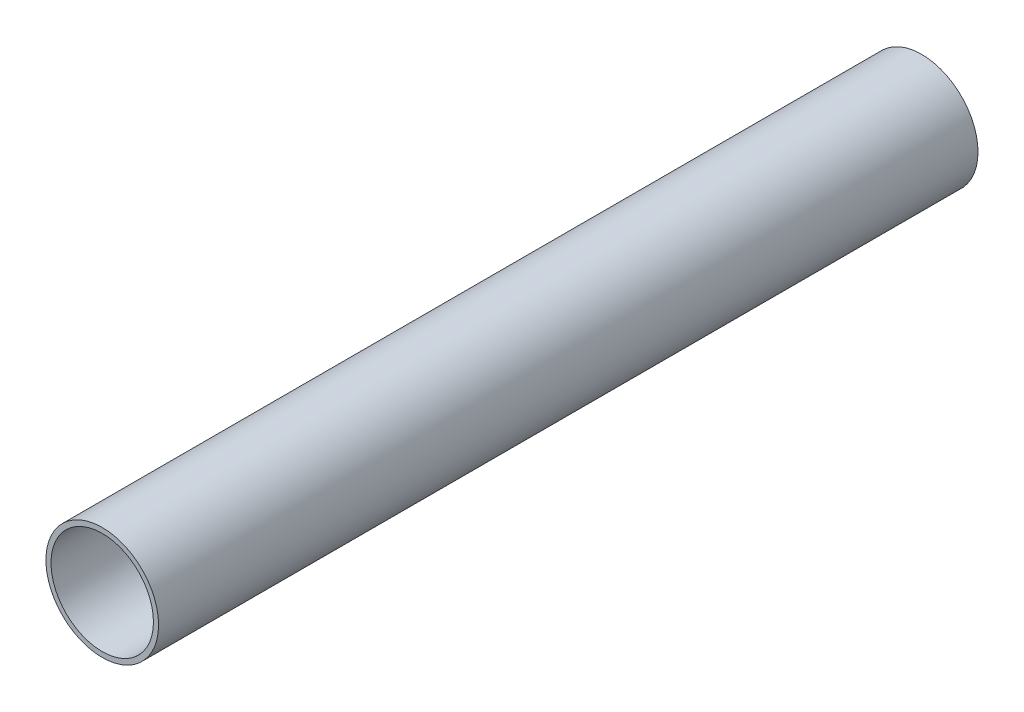
ISO-10303-21;
HEADER;
FILE_DESCRIPTION(('STEP AP214'),'2;1');
FILE_NAME('part.step','',(''),(''),'','','');
FILE_SCHEMA(('AUTOMOTIVE_DESIGN { 1 0 10303 214 1 1 1 1 }'));
ENDSEC;
DATA;
#1=APPLICATION_CONTEXT('core data for automotive mechanical design processes');
#2=APPLICATION_PROTOCOL_DEFINITION('international standard','automotive_design',2000,#1);
#3=PRODUCT_CONTEXT('',#1,'mechanical');
#4=PRODUCT('Part','Part','',(#3));
#5=PRODUCT_RELATED_PRODUCT_CATEGORY('part','',(#4));
#6=PRODUCT_DEFINITION_FORMATION('','',#4);
#7=PRODUCT_DEFINITION_CONTEXT('part definition',#1,'design');
#8=PRODUCT_DEFINITION('design','',#6,#7);
#9=PRODUCT_DEFINITION_SHAPE('','',#8);
#10=(LENGTH_UNIT() NAMED_UNIT(*) SI_UNIT(.MILLI.,.METRE.));
#11=(NAMED_UNIT(*) PLANE_ANGLE_UNIT() SI_UNIT($,.RADIAN.));
#12=(NAMED_UNIT(*) SI_UNIT($,.STERADIAN.) SOLID_ANGLE_UNIT());
#13=UNCERTAINTY_MEASURE_WITH_UNIT(LENGTH_MEASURE(1.E-05),#10,'distance_accuracy_value','');
#14=(GEOMETRIC_REPRESENTATION_CONTEXT(3) GLOBAL_UNCERTAINTY_ASSIGNED_CONTEXT((#13)) GLOBAL_UNIT_ASSIGNED_CONTEXT((#10,
#11,#12)) REPRESENTATION_CONTEXT('',''));
#15=CARTESIAN_POINT('',(0.,0.,0.));
#16=DIRECTION('',(0.,0.,1.));
#17=DIRECTION('',(1.,0.,0.));
#18=AXIS2_PLACEMENT_3D('',#15,#16,#17);
#19=CARTESIAN_POINT('',(0.,0.,80.));
#20=DIRECTION('',(0.,0.,1.));
#21=DIRECTION('',(1.,0.,0.));
#22=AXIS2_PLACEMENT_3D('',#19,#20,#21);
#23=PLANE('',#22);
#24=CARTESIAN_POINT('',(0.,0.,80.));
#25=DIRECTION('',(0.,0.,1.));
#26=DIRECTION('',(1.,0.,0.));
#27=AXIS2_PLACEMENT_3D('',#24,#25,#26);
#28=CIRCLE('',#27,5.5);
#29=CARTESIAN_POINT('',(5.5,0.,80.));
#30=VERTEX_POINT('',#29);
#31=EDGE_CURVE('E10',#30,#30,#28,.T.);
#32=ORIENTED_EDGE('',*,*,#31,.T.);
#33=EDGE_LOOP('',(#32));
#34=FACE_BOUND('',#33,.T.);
#35=CARTESIAN_POINT('',(0.,0.,80.));
#36=DIRECTION('',(0.,0.,1.));
#37=DIRECTION('',(1.,0.,0.));
#38=AXIS2_PLACEMENT_3D('',#35,#36,#37);
#39=CIRCLE('',#38,5.);
#40=CARTESIAN_POINT('',(5.,0.,80.));
#41=VERTEX_POINT('',#40);
#42=EDGE_CURVE('E50',#41,#41,#39,.T.);
#43=ORIENTED_EDGE('',*,*,#42,.F.);
#44=EDGE_LOOP('',(#43));
#45=FACE_BOUND('',#44,.T.);
#46=ADVANCED_FACE('F37',(#34,#45),#23,.T.);
#47=CARTESIAN_POINT('',(0.,0.,0.));
#48=DIRECTION('',(0.,0.,1.));
#49=DIRECTION('',(1.,0.,0.));
#50=AXIS2_PLACEMENT_3D('',#47,#48,#49);
#51=PLANE('',#50);
#52=CARTESIAN_POINT('',(0.,0.,0.));
#53=DIRECTION('',(0.,0.,1.));
#54=DIRECTION('',(1.,0.,0.));
#55=AXIS2_PLACEMENT_3D('',#52,#53,#54);
#56=CIRCLE('',#55,5.5);
#57=CARTESIAN_POINT('',(5.5,0.,0.));
#58=VERTEX_POINT('',#57);
#59=EDGE_CURVE('E41',#58,#58,#56,.T.);
#60=ORIENTED_EDGE('',*,*,#59,.F.);
#61=EDGE_LOOP('',(#60));
#62=FACE_BOUND('',#61,.T.);
#63=CARTESIAN_POINT('',(0.,0.,0.));
#64=DIRECTION('',(0.,0.,1.));
#65=DIRECTION('',(1.,0.,0.));
#66=AXIS2_PLACEMENT_3D('',#63,#64,#65);
#67=CIRCLE('',#66,5.);
#68=CARTESIAN_POINT('',(5.,0.,0.));
#69=VERTEX_POINT('',#68);
#70=EDGE_CURVE('E52',#69,#69,#67,.T.);
#71=ORIENTED_EDGE('',*,*,#70,.T.);
#72=EDGE_LOOP('',(#71));
#73=FACE_BOUND('',#72,.T.);
#74=ADVANCED_FACE('F64',(#62,#73),#51,.F.);
#75=CARTESIAN_POINT('',(0.,0.,80.));
#76=DIRECTION('',(0.,0.,-1.));
#77=DIRECTION('',(-1.,0.,0.));
#78=AXIS2_PLACEMENT_3D('',#75,#76,#77);
#79=CYLINDRICAL_SURFACE('',#78,5.5);
#80=ORIENTED_EDGE('',*,*,#31,.F.);
#81=EDGE_LOOP('',(#80));
#82=FACE_BOUND('',#81,.T.);
#83=ORIENTED_EDGE('',*,*,#59,.T.);
#84=EDGE_LOOP('',(#83));
#85=FACE_BOUND('',#84,.T.);
#86=ADVANCED_FACE('F39',(#82,#85),#79,.T.);
#87=CARTESIAN_POINT('',(0.,0.,80.));
#88=DIRECTION('',(0.,0.,-1.));
#89=DIRECTION('',(-1.,0.,0.));
#90=AXIS2_PLACEMENT_3D('',#87,#88,#89);
#91=CYLINDRICAL_SURFACE('',#90,5.);
#92=ORIENTED_EDGE('',*,*,#42,.T.);
#93=EDGE_LOOP('',(#92));
#94=FACE_BOUND('',#93,.T.);
#95=ORIENTED_EDGE('',*,*,#70,.F.);
#96=EDGE_LOOP('',(#95));
#97=FACE_BOUND('',#96,.T.);
#98=ADVANCED_FACE('F60',(#94,#97),#91,.F.);
#99=CLOSED_SHELL('',(#46,#74,#86,#98));
#100=MANIFOLD_SOLID_BREP('B2',#99);
#101=ADVANCED_BREP_SHAPE_REPRESENTATION('',(#18,#100),#14);
#102=SHAPE_DEFINITION_REPRESENTATION(#9,#101);
ENDSEC;
END-ISO-10303-21;
